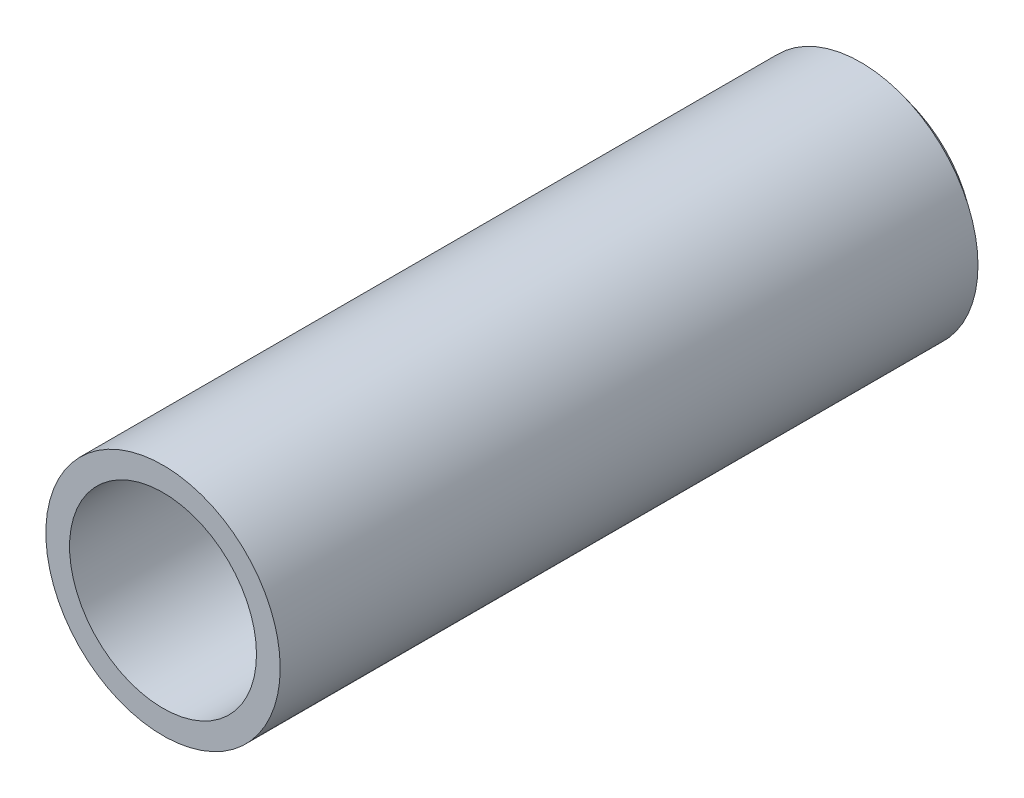
ISO-10303-21;
HEADER;
FILE_DESCRIPTION(('STEP AP214'),'2;1');
FILE_NAME('part.step','',(''),(''),'','','');
FILE_SCHEMA(('AUTOMOTIVE_DESIGN { 1 0 10303 214 1 1 1 1 }'));
ENDSEC;
DATA;
#1=APPLICATION_CONTEXT('core data for automotive mechanical design processes');
#2=APPLICATION_PROTOCOL_DEFINITION('international standard','automotive_design',2000,#1);
#3=PRODUCT_CONTEXT('',#1,'mechanical');
#4=PRODUCT('Part','Part','',(#3));
#5=PRODUCT_RELATED_PRODUCT_CATEGORY('part','',(#4));
#6=PRODUCT_DEFINITION_FORMATION('','',#4);
#7=PRODUCT_DEFINITION_CONTEXT('part definition',#1,'design');
#8=PRODUCT_DEFINITION('design','',#6,#7);
#9=PRODUCT_DEFINITION_SHAPE('','',#8);
#10=(LENGTH_UNIT() NAMED_UNIT(*) SI_UNIT(.MILLI.,.METRE.));
#11=(NAMED_UNIT(*) PLANE_ANGLE_UNIT() SI_UNIT($,.RADIAN.));
#12=(NAMED_UNIT(*) SI_UNIT($,.STERADIAN.) SOLID_ANGLE_UNIT());
#13=UNCERTAINTY_MEASURE_WITH_UNIT(LENGTH_MEASURE(1.E-05),#10,'distance_accuracy_value','');
#14=(GEOMETRIC_REPRESENTATION_CONTEXT(3) GLOBAL_UNCERTAINTY_ASSIGNED_CONTEXT((#13)) GLOBAL_UNIT_ASSIGNED_CONTEXT((#10,
#11,#12)) REPRESENTATION_CONTEXT('',''));
#15=CARTESIAN_POINT('',(0.,0.,0.));
#16=DIRECTION('',(0.,0.,1.));
#17=DIRECTION('',(1.,0.,0.));
#18=AXIS2_PLACEMENT_3D('',#15,#16,#17);
#19=CARTESIAN_POINT('',(0.,0.,50.8));
#20=DIRECTION('',(0.,0.,1.));
#21=DIRECTION('',(1.,0.,0.));
#22=AXIS2_PLACEMENT_3D('',#19,#20,#21);
#23=PLANE('',#22);
#24=CARTESIAN_POINT('',(0.,0.,50.8));
#25=DIRECTION('',(0.,0.,1.));
#26=DIRECTION('',(1.,0.,0.));
#27=AXIS2_PLACEMENT_3D('',#24,#25,#26);
#28=CIRCLE('',#27,16.7005);
#29=CARTESIAN_POINT('',(16.7005,0.,50.8));
#30=VERTEX_POINT('',#29);
#31=EDGE_CURVE('E51',#30,#30,#28,.T.);
#32=ORIENTED_EDGE('',*,*,#31,.T.);
#33=EDGE_LOOP('',(#32));
#34=FACE_BOUND('',#33,.T.);
#35=CARTESIAN_POINT('',(0.,0.,50.8));
#36=DIRECTION('',(0.,0.,1.));
#37=DIRECTION('',(1.,0.,0.));
#38=AXIS2_PLACEMENT_3D('',#35,#36,#37);
#39=CIRCLE('',#38,13.3223);
#40=CARTESIAN_POINT('',(13.3223,0.,50.8));
#41=VERTEX_POINT('',#40);
#42=EDGE_CURVE('E55',#41,#41,#39,.T.);
#43=ORIENTED_EDGE('',*,*,#42,.F.);
#44=EDGE_LOOP('',(#43));
#45=FACE_BOUND('',#44,.T.);
#46=ADVANCED_FACE('F37',(#34,#45),#23,.T.);
#47=CARTESIAN_POINT('',(0.,0.,-50.8));
#48=DIRECTION('',(0.,0.,1.));
#49=DIRECTION('',(1.,0.,0.));
#50=AXIS2_PLACEMENT_3D('',#47,#48,#49);
#51=PLANE('',#50);
#52=CARTESIAN_POINT('',(0.,0.,-50.8));
#53=DIRECTION('',(0.,0.,1.));
#54=DIRECTION('',(1.,0.,0.));
#55=AXIS2_PLACEMENT_3D('',#52,#53,#54);
#56=CIRCLE('',#55,13.9065);
#57=CARTESIAN_POINT('',(13.9065,0.,-50.8));
#58=VERTEX_POINT('',#57);
#59=EDGE_CURVE('E10',#58,#58,#56,.F.);
#60=ORIENTED_EDGE('',*,*,#59,.T.);
#61=EDGE_LOOP('',(#60));
#62=FACE_BOUND('',#61,.T.);
#63=CARTESIAN_POINT('',(0.,0.,-50.8));
#64=DIRECTION('',(0.,0.,1.));
#65=DIRECTION('',(1.,0.,0.));
#66=AXIS2_PLACEMENT_3D('',#63,#64,#65);
#67=CIRCLE('',#66,13.3223);
#68=CARTESIAN_POINT('',(13.3223,0.,-50.8));
#69=VERTEX_POINT('',#68);
#70=EDGE_CURVE('E58',#69,#69,#67,.T.);
#71=ORIENTED_EDGE('',*,*,#70,.T.);
#72=EDGE_LOOP('',(#71));
#73=FACE_BOUND('',#72,.T.);
#74=ADVANCED_FACE('F68',(#62,#73),#51,.F.);
#75=CARTESIAN_POINT('',(0.,0.,50.8));
#76=DIRECTION('',(0.,0.,-1.));
#77=DIRECTION('',(-1.,0.,0.));
#78=AXIS2_PLACEMENT_3D('',#75,#76,#77);
#79=CYLINDRICAL_SURFACE('',#78,16.7005);
#80=CARTESIAN_POINT('',(0.,0.,-48.6560883955868));
#81=DIRECTION('',(0.,0.,1.));
#82=DIRECTION('',(1.,0.,0.));
#83=AXIS2_PLACEMENT_3D('',#80,#81,#82);
#84=CIRCLE('',#83,16.7005);
#85=CARTESIAN_POINT('',(16.7005,0.,-48.6560883955868));
#86=VERTEX_POINT('',#85);
#87=EDGE_CURVE('E45',#86,#86,#84,.T.);
#88=ORIENTED_EDGE('',*,*,#87,.T.);
#89=EDGE_LOOP('',(#88));
#90=FACE_BOUND('',#89,.T.);
#91=ORIENTED_EDGE('',*,*,#31,.F.);
#92=EDGE_LOOP('',(#91));
#93=FACE_BOUND('',#92,.T.);
#94=ADVANCED_FACE('F74',(#90,#93),#79,.T.);
#95=CARTESIAN_POINT('',(0.,0.,50.8));
#96=DIRECTION('',(0.,0.,-1.));
#97=DIRECTION('',(-1.,0.,0.));
#98=AXIS2_PLACEMENT_3D('',#95,#96,#97);
#99=CYLINDRICAL_SURFACE('',#98,13.3223);
#100=ORIENTED_EDGE('',*,*,#42,.T.);
#101=EDGE_LOOP('',(#100));
#102=FACE_BOUND('',#101,.T.);
#103=ORIENTED_EDGE('',*,*,#70,.F.);
#104=EDGE_LOOP('',(#103));
#105=FACE_BOUND('',#104,.T.);
#106=ADVANCED_FACE('F64',(#102,#105),#99,.F.);
#107=CARTESIAN_POINT('',(0.,0.,-48.6560883955868));
#108=DIRECTION('',(0.,0.,1.));
#109=DIRECTION('',(1.,0.,0.));
#110=AXIS2_PLACEMENT_3D('',#107,#108,#109);
#111=CONICAL_SURFACE('',#110,16.7005,0.916297857297026);
#112=ORIENTED_EDGE('',*,*,#59,.F.);
#113=EDGE_LOOP('',(#112));
#114=FACE_BOUND('',#113,.T.);
#115=ORIENTED_EDGE('',*,*,#87,.F.);
#116=EDGE_LOOP('',(#115));
#117=FACE_BOUND('',#116,.T.);
#118=ADVANCED_FACE('F39',(#114,#117),#111,.T.);
#119=CLOSED_SHELL('',(#46,#74,#94,#106,#118));
#120=MANIFOLD_SOLID_BREP('B2',#119);
#121=ADVANCED_BREP_SHAPE_REPRESENTATION('',(#18,#120),#14);
#122=SHAPE_DEFINITION_REPRESENTATION(#9,#121);
ENDSEC;
END-ISO-10303-21;
